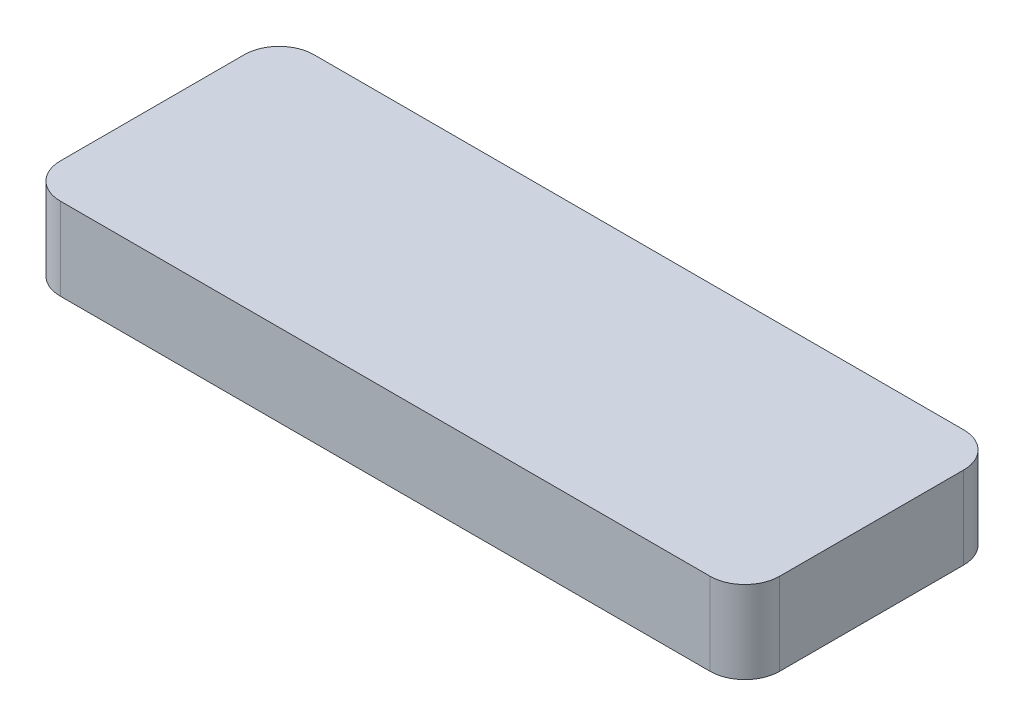
ISO-10303-21;
HEADER;
FILE_DESCRIPTION(('STEP AP214'),'2;1');
FILE_NAME('part.step','',(''),(''),'','','');
FILE_SCHEMA(('AUTOMOTIVE_DESIGN { 1 0 10303 214 1 1 1 1 }'));
ENDSEC;
DATA;
#1=APPLICATION_CONTEXT('core data for automotive mechanical design processes');
#2=APPLICATION_PROTOCOL_DEFINITION('international standard','automotive_design',2000,#1);
#3=PRODUCT_CONTEXT('',#1,'mechanical');
#4=PRODUCT('Part','Part','',(#3));
#5=PRODUCT_RELATED_PRODUCT_CATEGORY('part','',(#4));
#6=PRODUCT_DEFINITION_FORMATION('','',#4);
#7=PRODUCT_DEFINITION_CONTEXT('part definition',#1,'design');
#8=PRODUCT_DEFINITION('design','',#6,#7);
#9=PRODUCT_DEFINITION_SHAPE('','',#8);
#10=(LENGTH_UNIT() NAMED_UNIT(*) SI_UNIT(.MILLI.,.METRE.));
#11=(NAMED_UNIT(*) PLANE_ANGLE_UNIT() SI_UNIT($,.RADIAN.));
#12=(NAMED_UNIT(*) SI_UNIT($,.STERADIAN.) SOLID_ANGLE_UNIT());
#13=UNCERTAINTY_MEASURE_WITH_UNIT(LENGTH_MEASURE(1.E-05),#10,'distance_accuracy_value','');
#14=(GEOMETRIC_REPRESENTATION_CONTEXT(3) GLOBAL_UNCERTAINTY_ASSIGNED_CONTEXT((#13)) GLOBAL_UNIT_ASSIGNED_CONTEXT((#10,
#11,#12)) REPRESENTATION_CONTEXT('',''));
#15=CARTESIAN_POINT('',(0.,0.,0.));
#16=DIRECTION('',(0.,0.,1.));
#17=DIRECTION('',(1.,0.,0.));
#18=AXIS2_PLACEMENT_3D('',#15,#16,#17);
#19=CARTESIAN_POINT('',(0.,3.55,0.));
#20=DIRECTION('',(0.,1.,0.));
#21=DIRECTION('',(1.,0.,0.));
#22=AXIS2_PLACEMENT_3D('',#19,#20,#21);
#23=PLANE('',#22);
#24=CARTESIAN_POINT('',(-14.,3.55,9.43));
#25=DIRECTION('',(0.,-1.,0.));
#26=DIRECTION('',(0.,0.,1.));
#27=AXIS2_PLACEMENT_3D('',#24,#25,#26);
#28=CIRCLE('',#27,1.5);
#29=CARTESIAN_POINT('',(-14.,3.55,10.93));
#30=VERTEX_POINT('',#29);
#31=CARTESIAN_POINT('',(-15.5,3.55,9.43));
#32=VERTEX_POINT('',#31);
#33=EDGE_CURVE('E11',#30,#32,#28,.T.);
#34=ORIENTED_EDGE('',*,*,#33,.F.);
#35=DIRECTION('',(1.,0.,0.));
#36=VECTOR('',#35,1.);
#37=CARTESIAN_POINT('',(-14.,3.55,10.93));
#38=LINE('',#37,#36);
#39=CARTESIAN_POINT('',(14.,3.55,10.93));
#40=VERTEX_POINT('',#39);
#41=EDGE_CURVE('E46',#30,#40,#38,.T.);
#42=ORIENTED_EDGE('',*,*,#41,.T.);
#43=CARTESIAN_POINT('',(14.,3.55,9.43));
#44=DIRECTION('',(0.,-1.,0.));
#45=DIRECTION('',(1.,0.,0.));
#46=AXIS2_PLACEMENT_3D('',#43,#44,#45);
#47=CIRCLE('',#46,1.5);
#48=CARTESIAN_POINT('',(15.5,3.55,9.43));
#49=VERTEX_POINT('',#48);
#50=EDGE_CURVE('E91',#49,#40,#47,.T.);
#51=ORIENTED_EDGE('',*,*,#50,.F.);
#52=DIRECTION('',(0.,0.,-1.));
#53=VECTOR('',#52,1.);
#54=CARTESIAN_POINT('',(15.5,3.55,9.43));
#55=LINE('',#54,#53);
#56=CARTESIAN_POINT('',(15.5,3.55,1.5));
#57=VERTEX_POINT('',#56);
#58=EDGE_CURVE('E85',#49,#57,#55,.T.);
#59=ORIENTED_EDGE('',*,*,#58,.T.);
#60=CARTESIAN_POINT('',(14.,3.55,1.5));
#61=DIRECTION('',(0.,-1.,0.));
#62=DIRECTION('',(0.,0.,-1.));
#63=AXIS2_PLACEMENT_3D('',#60,#61,#62);
#64=CIRCLE('',#63,1.5);
#65=CARTESIAN_POINT('',(14.,3.55,0.));
#66=VERTEX_POINT('',#65);
#67=EDGE_CURVE('E88',#66,#57,#64,.T.);
#68=ORIENTED_EDGE('',*,*,#67,.F.);
#69=DIRECTION('',(-1.,0.,0.));
#70=VECTOR('',#69,1.);
#71=CARTESIAN_POINT('',(14.,3.55,0.));
#72=LINE('',#71,#70);
#73=CARTESIAN_POINT('',(-14.,3.55,0.));
#74=VERTEX_POINT('',#73);
#75=EDGE_CURVE('E117',#66,#74,#72,.T.);
#76=ORIENTED_EDGE('',*,*,#75,.T.);
#77=CARTESIAN_POINT('',(-14.,3.55,1.5));
#78=DIRECTION('',(0.,-1.,0.));
#79=DIRECTION('',(-1.,0.,0.));
#80=AXIS2_PLACEMENT_3D('',#77,#78,#79);
#81=CIRCLE('',#80,1.5);
#82=CARTESIAN_POINT('',(-15.5,3.55,1.5));
#83=VERTEX_POINT('',#82);
#84=EDGE_CURVE('E125',#83,#74,#81,.T.);
#85=ORIENTED_EDGE('',*,*,#84,.F.);
#86=DIRECTION('',(0.,0.,1.));
#87=VECTOR('',#86,1.);
#88=CARTESIAN_POINT('',(-15.5,3.55,1.5));
#89=LINE('',#88,#87);
#90=EDGE_CURVE('E126',#83,#32,#89,.T.);
#91=ORIENTED_EDGE('',*,*,#90,.T.);
#92=EDGE_LOOP('',(#34,#42,#51,#59,#68,#76,#85,#91));
#93=FACE_BOUND('',#92,.T.);
#94=ADVANCED_FACE('F17',(#93),#23,.T.);
#95=CARTESIAN_POINT('',(-14.,0.,9.43));
#96=DIRECTION('',(0.,-1.,0.));
#97=DIRECTION('',(0.,0.,1.));
#98=AXIS2_PLACEMENT_3D('',#95,#96,#97);
#99=CYLINDRICAL_SURFACE('',#98,1.5);
#100=ORIENTED_EDGE('',*,*,#33,.T.);
#101=DIRECTION('',(0.,1.,0.));
#102=VECTOR('',#101,1.);
#103=CARTESIAN_POINT('',(-15.5,0.,9.43));
#104=LINE('',#103,#102);
#105=CARTESIAN_POINT('',(-15.5,0.,9.43));
#106=VERTEX_POINT('',#105);
#107=EDGE_CURVE('E121',#106,#32,#104,.T.);
#108=ORIENTED_EDGE('',*,*,#107,.F.);
#109=CARTESIAN_POINT('',(-14.,0.,9.43));
#110=DIRECTION('',(0.,-1.,0.));
#111=DIRECTION('',(0.,0.,1.));
#112=AXIS2_PLACEMENT_3D('',#109,#110,#111);
#113=CIRCLE('',#112,1.5);
#114=CARTESIAN_POINT('',(-14.,0.,10.93));
#115=VERTEX_POINT('',#114);
#116=EDGE_CURVE('E149',#115,#106,#113,.T.);
#117=ORIENTED_EDGE('',*,*,#116,.F.);
#118=DIRECTION('',(0.,1.,0.));
#119=VECTOR('',#118,1.);
#120=CARTESIAN_POINT('',(-14.,0.,10.93));
#121=LINE('',#120,#119);
#122=EDGE_CURVE('E26',#115,#30,#121,.T.);
#123=ORIENTED_EDGE('',*,*,#122,.T.);
#124=EDGE_LOOP('',(#100,#108,#117,#123));
#125=FACE_BOUND('',#124,.T.);
#126=ADVANCED_FACE('F146',(#125),#99,.T.);
#127=CARTESIAN_POINT('',(-15.5,0.,10.93));
#128=DIRECTION('',(0.,0.,1.));
#129=DIRECTION('',(1.,0.,0.));
#130=AXIS2_PLACEMENT_3D('',#127,#128,#129);
#131=PLANE('',#130);
#132=DIRECTION('',(0.,1.,0.));
#133=VECTOR('',#132,1.);
#134=CARTESIAN_POINT('',(14.,0.,10.93));
#135=LINE('',#134,#133);
#136=CARTESIAN_POINT('',(14.,0.,10.93));
#137=VERTEX_POINT('',#136);
#138=EDGE_CURVE('E138',#137,#40,#135,.T.);
#139=ORIENTED_EDGE('',*,*,#138,.T.);
#140=ORIENTED_EDGE('',*,*,#41,.F.);
#141=ORIENTED_EDGE('',*,*,#122,.F.);
#142=DIRECTION('',(1.,0.,0.));
#143=VECTOR('',#142,1.);
#144=CARTESIAN_POINT('',(-14.,0.,10.93));
#145=LINE('',#144,#143);
#146=EDGE_CURVE('E153',#115,#137,#145,.T.);
#147=ORIENTED_EDGE('',*,*,#146,.T.);
#148=EDGE_LOOP('',(#139,#140,#141,#147));
#149=FACE_BOUND('',#148,.T.);
#150=ADVANCED_FACE('F19',(#149),#131,.T.);
#151=CARTESIAN_POINT('',(14.,0.,9.43));
#152=DIRECTION('',(0.,-1.,0.));
#153=DIRECTION('',(1.,0.,0.));
#154=AXIS2_PLACEMENT_3D('',#151,#152,#153);
#155=CYLINDRICAL_SURFACE('',#154,1.5);
#156=ORIENTED_EDGE('',*,*,#50,.T.);
#157=ORIENTED_EDGE('',*,*,#138,.F.);
#158=CARTESIAN_POINT('',(14.,0.,9.43));
#159=DIRECTION('',(0.,-1.,0.));
#160=DIRECTION('',(1.,0.,0.));
#161=AXIS2_PLACEMENT_3D('',#158,#159,#160);
#162=CIRCLE('',#161,1.5);
#163=CARTESIAN_POINT('',(15.5,0.,9.43));
#164=VERTEX_POINT('',#163);
#165=EDGE_CURVE('E158',#164,#137,#162,.T.);
#166=ORIENTED_EDGE('',*,*,#165,.F.);
#167=DIRECTION('',(0.,1.,0.));
#168=VECTOR('',#167,1.);
#169=CARTESIAN_POINT('',(15.5,0.,9.43));
#170=LINE('',#169,#168);
#171=EDGE_CURVE('E95',#164,#49,#170,.T.);
#172=ORIENTED_EDGE('',*,*,#171,.T.);
#173=EDGE_LOOP('',(#156,#157,#166,#172));
#174=FACE_BOUND('',#173,.T.);
#175=ADVANCED_FACE('F157',(#174),#155,.T.);
#176=CARTESIAN_POINT('',(15.5,0.,10.93));
#177=DIRECTION('',(1.,0.,0.));
#178=DIRECTION('',(0.,1.,0.));
#179=AXIS2_PLACEMENT_3D('',#176,#177,#178);
#180=PLANE('',#179);
#181=DIRECTION('',(0.,1.,0.));
#182=VECTOR('',#181,1.);
#183=CARTESIAN_POINT('',(15.5,0.,1.5));
#184=LINE('',#183,#182);
#185=CARTESIAN_POINT('',(15.5,0.,1.5));
#186=VERTEX_POINT('',#185);
#187=EDGE_CURVE('E96',#186,#57,#184,.T.);
#188=ORIENTED_EDGE('',*,*,#187,.T.);
#189=ORIENTED_EDGE('',*,*,#58,.F.);
#190=ORIENTED_EDGE('',*,*,#171,.F.);
#191=DIRECTION('',(0.,0.,-1.));
#192=VECTOR('',#191,1.);
#193=CARTESIAN_POINT('',(15.5,0.,9.43));
#194=LINE('',#193,#192);
#195=EDGE_CURVE('E101',#164,#186,#194,.T.);
#196=ORIENTED_EDGE('',*,*,#195,.T.);
#197=EDGE_LOOP('',(#188,#189,#190,#196));
#198=FACE_BOUND('',#197,.T.);
#199=ADVANCED_FACE('F99',(#198),#180,.T.);
#200=CARTESIAN_POINT('',(14.,0.,1.5));
#201=DIRECTION('',(0.,-1.,0.));
#202=DIRECTION('',(0.,0.,-1.));
#203=AXIS2_PLACEMENT_3D('',#200,#201,#202);
#204=CYLINDRICAL_SURFACE('',#203,1.5);
#205=ORIENTED_EDGE('',*,*,#67,.T.);
#206=ORIENTED_EDGE('',*,*,#187,.F.);
#207=CARTESIAN_POINT('',(14.,0.,1.5));
#208=DIRECTION('',(0.,-1.,0.));
#209=DIRECTION('',(0.,0.,-1.));
#210=AXIS2_PLACEMENT_3D('',#207,#208,#209);
#211=CIRCLE('',#210,1.5);
#212=CARTESIAN_POINT('',(14.,0.,0.));
#213=VERTEX_POINT('',#212);
#214=EDGE_CURVE('E165',#213,#186,#211,.T.);
#215=ORIENTED_EDGE('',*,*,#214,.F.);
#216=DIRECTION('',(0.,1.,0.));
#217=VECTOR('',#216,1.);
#218=CARTESIAN_POINT('',(14.,0.,0.));
#219=LINE('',#218,#217);
#220=EDGE_CURVE('E109',#213,#66,#219,.T.);
#221=ORIENTED_EDGE('',*,*,#220,.T.);
#222=EDGE_LOOP('',(#205,#206,#215,#221));
#223=FACE_BOUND('',#222,.T.);
#224=ADVANCED_FACE('F107',(#223),#204,.T.);
#225=CARTESIAN_POINT('',(15.5,0.,0.));
#226=DIRECTION('',(0.,0.,-1.));
#227=DIRECTION('',(0.,-1.,0.));
#228=AXIS2_PLACEMENT_3D('',#225,#226,#227);
#229=PLANE('',#228);
#230=DIRECTION('',(0.,1.,0.));
#231=VECTOR('',#230,1.);
#232=CARTESIAN_POINT('',(-14.,0.,0.));
#233=LINE('',#232,#231);
#234=CARTESIAN_POINT('',(-14.,0.,0.));
#235=VERTEX_POINT('',#234);
#236=EDGE_CURVE('E131',#235,#74,#233,.T.);
#237=ORIENTED_EDGE('',*,*,#236,.T.);
#238=ORIENTED_EDGE('',*,*,#75,.F.);
#239=ORIENTED_EDGE('',*,*,#220,.F.);
#240=DIRECTION('',(-1.,0.,0.));
#241=VECTOR('',#240,1.);
#242=CARTESIAN_POINT('',(14.,0.,0.));
#243=LINE('',#242,#241);
#244=EDGE_CURVE('E171',#213,#235,#243,.T.);
#245=ORIENTED_EDGE('',*,*,#244,.T.);
#246=EDGE_LOOP('',(#237,#238,#239,#245));
#247=FACE_BOUND('',#246,.T.);
#248=ADVANCED_FACE('F218',(#247),#229,.T.);
#249=CARTESIAN_POINT('',(-14.,0.,1.5));
#250=DIRECTION('',(0.,-1.,0.));
#251=DIRECTION('',(-1.,0.,0.));
#252=AXIS2_PLACEMENT_3D('',#249,#250,#251);
#253=CYLINDRICAL_SURFACE('',#252,1.5);
#254=ORIENTED_EDGE('',*,*,#84,.T.);
#255=ORIENTED_EDGE('',*,*,#236,.F.);
#256=CARTESIAN_POINT('',(-14.,0.,1.5));
#257=DIRECTION('',(0.,-1.,0.));
#258=DIRECTION('',(-1.,0.,0.));
#259=AXIS2_PLACEMENT_3D('',#256,#257,#258);
#260=CIRCLE('',#259,1.5);
#261=CARTESIAN_POINT('',(-15.5,0.,1.5));
#262=VERTEX_POINT('',#261);
#263=EDGE_CURVE('E209',#262,#235,#260,.T.);
#264=ORIENTED_EDGE('',*,*,#263,.F.);
#265=DIRECTION('',(0.,1.,0.));
#266=VECTOR('',#265,1.);
#267=CARTESIAN_POINT('',(-15.5,0.,1.5));
#268=LINE('',#267,#266);
#269=EDGE_CURVE('E123',#262,#83,#268,.T.);
#270=ORIENTED_EDGE('',*,*,#269,.T.);
#271=EDGE_LOOP('',(#254,#255,#264,#270));
#272=FACE_BOUND('',#271,.T.);
#273=ADVANCED_FACE('F210',(#272),#253,.T.);
#274=CARTESIAN_POINT('',(-15.5,0.,0.));
#275=DIRECTION('',(-1.,0.,0.));
#276=DIRECTION('',(0.,0.,1.));
#277=AXIS2_PLACEMENT_3D('',#274,#275,#276);
#278=PLANE('',#277);
#279=ORIENTED_EDGE('',*,*,#107,.T.);
#280=ORIENTED_EDGE('',*,*,#90,.F.);
#281=ORIENTED_EDGE('',*,*,#269,.F.);
#282=DIRECTION('',(0.,0.,1.));
#283=VECTOR('',#282,1.);
#284=CARTESIAN_POINT('',(-15.5,0.,1.5));
#285=LINE('',#284,#283);
#286=EDGE_CURVE('E182',#262,#106,#285,.T.);
#287=ORIENTED_EDGE('',*,*,#286,.T.);
#288=EDGE_LOOP('',(#279,#280,#281,#287));
#289=FACE_BOUND('',#288,.T.);
#290=ADVANCED_FACE('F192',(#289),#278,.T.);
#291=CARTESIAN_POINT('',(0.,0.,0.));
#292=DIRECTION('',(0.,1.,0.));
#293=DIRECTION('',(1.,0.,0.));
#294=AXIS2_PLACEMENT_3D('',#291,#292,#293);
#295=PLANE('',#294);
#296=ORIENTED_EDGE('',*,*,#263,.T.);
#297=ORIENTED_EDGE('',*,*,#244,.F.);
#298=ORIENTED_EDGE('',*,*,#214,.T.);
#299=ORIENTED_EDGE('',*,*,#195,.F.);
#300=ORIENTED_EDGE('',*,*,#165,.T.);
#301=ORIENTED_EDGE('',*,*,#146,.F.);
#302=ORIENTED_EDGE('',*,*,#116,.T.);
#303=ORIENTED_EDGE('',*,*,#286,.F.);
#304=EDGE_LOOP('',(#296,#297,#298,#299,#300,#301,#302,#303));
#305=FACE_BOUND('',#304,.T.);
#306=ADVANCED_FACE('F163',(#305),#295,.F.);
#307=CLOSED_SHELL('',(#94,#126,#150,#175,#199,#224,#248,#273,#290,#306));
#308=MANIFOLD_SOLID_BREP('B1',#307);
#309=ADVANCED_BREP_SHAPE_REPRESENTATION('',(#18,#308),#14);
#310=SHAPE_DEFINITION_REPRESENTATION(#9,#309);
ENDSEC;
END-ISO-10303-21;
